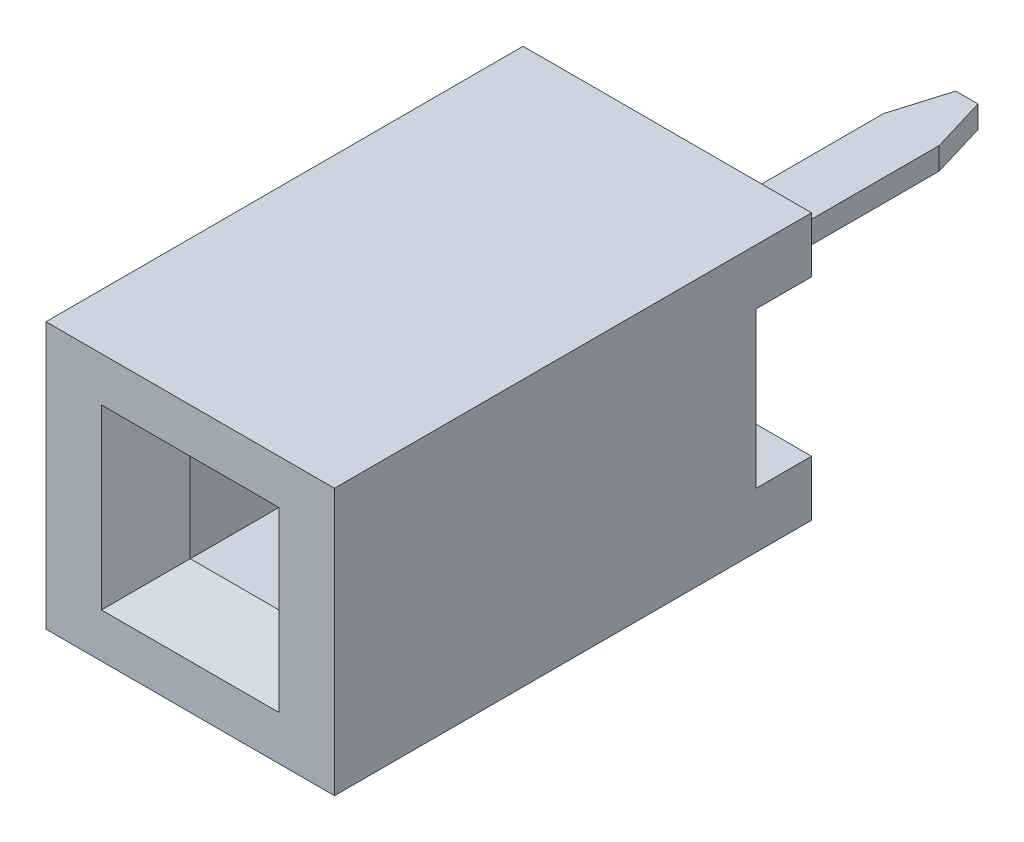
ISO-10303-21;
HEADER;
FILE_DESCRIPTION(('STEP AP214'),'2;1');
FILE_NAME('part.step','',(''),(''),'','','');
FILE_SCHEMA(('AUTOMOTIVE_DESIGN { 1 0 10303 214 1 1 1 1 }'));
ENDSEC;
DATA;
#1=APPLICATION_CONTEXT('core data for automotive mechanical design processes');
#2=APPLICATION_PROTOCOL_DEFINITION('international standard','automotive_design',2000,#1);
#3=PRODUCT_CONTEXT('',#1,'mechanical');
#4=PRODUCT('Part','Part','',(#3));
#5=PRODUCT_RELATED_PRODUCT_CATEGORY('part','',(#4));
#6=PRODUCT_DEFINITION_FORMATION('','',#4);
#7=PRODUCT_DEFINITION_CONTEXT('part definition',#1,'design');
#8=PRODUCT_DEFINITION('design','',#6,#7);
#9=PRODUCT_DEFINITION_SHAPE('','',#8);
#10=(LENGTH_UNIT() NAMED_UNIT(*) SI_UNIT(.MILLI.,.METRE.));
#11=(NAMED_UNIT(*) PLANE_ANGLE_UNIT() SI_UNIT($,.RADIAN.));
#12=(NAMED_UNIT(*) SI_UNIT($,.STERADIAN.) SOLID_ANGLE_UNIT());
#13=UNCERTAINTY_MEASURE_WITH_UNIT(LENGTH_MEASURE(1.E-05),#10,'distance_accuracy_value','');
#14=(GEOMETRIC_REPRESENTATION_CONTEXT(3) GLOBAL_UNCERTAINTY_ASSIGNED_CONTEXT((#13)) GLOBAL_UNIT_ASSIGNED_CONTEXT((#10,
#11,#12)) REPRESENTATION_CONTEXT('',''));
#15=CARTESIAN_POINT('',(0.,0.,0.));
#16=DIRECTION('',(0.,0.,1.));
#17=DIRECTION('',(1.,0.,0.));
#18=AXIS2_PLACEMENT_3D('',#15,#16,#17);
#19=CARTESIAN_POINT('',(-1.3,-0.700000000000001,1.2));
#20=DIRECTION('',(0.,0.,1.));
#21=DIRECTION('',(1.,0.,0.));
#22=AXIS2_PLACEMENT_3D('',#19,#20,#21);
#23=PLANE('',#22);
#24=DIRECTION('',(0.,-1.,0.));
#25=VECTOR('',#24,1.);
#26=CARTESIAN_POINT('',(0.4,-0.400000000000001,1.2));
#27=LINE('',#26,#25);
#28=CARTESIAN_POINT('',(0.4,-0.1,1.2));
#29=VERTEX_POINT('',#28);
#30=CARTESIAN_POINT('',(0.4,-0.400000000000001,1.2));
#31=VERTEX_POINT('',#30);
#32=EDGE_CURVE('E250',#29,#31,#27,.T.);
#33=ORIENTED_EDGE('',*,*,#32,.F.);
#34=DIRECTION('',(-1.,0.,0.));
#35=VECTOR('',#34,1.);
#36=CARTESIAN_POINT('',(0.4,-0.1,1.2));
#37=LINE('',#36,#35);
#38=CARTESIAN_POINT('',(-0.4,-0.1,1.2));
#39=VERTEX_POINT('',#38);
#40=EDGE_CURVE('E386',#29,#39,#37,.T.);
#41=ORIENTED_EDGE('',*,*,#40,.T.);
#42=DIRECTION('',(0.,1.,0.));
#43=VECTOR('',#42,1.);
#44=CARTESIAN_POINT('',(-0.4,-0.400000000000001,1.2));
#45=LINE('',#44,#43);
#46=CARTESIAN_POINT('',(-0.4,-0.400000000000001,1.2));
#47=VERTEX_POINT('',#46);
#48=EDGE_CURVE('E258',#47,#39,#45,.T.);
#49=ORIENTED_EDGE('',*,*,#48,.F.);
#50=DIRECTION('',(-1.,0.,0.));
#51=VECTOR('',#50,1.);
#52=CARTESIAN_POINT('',(0.4,-0.400000000000001,1.2));
#53=LINE('',#52,#51);
#54=EDGE_CURVE('E261',#31,#47,#53,.T.);
#55=ORIENTED_EDGE('',*,*,#54,.F.);
#56=EDGE_LOOP('',(#33,#41,#49,#55));
#57=FACE_BOUND('',#56,.T.);
#58=ADVANCED_FACE('F36',(#57),#23,.T.);
#59=CARTESIAN_POINT('',(-1.3,-0.700000000000001,0.5));
#60=DIRECTION('',(0.,0.,1.));
#61=DIRECTION('',(1.,0.,0.));
#62=AXIS2_PLACEMENT_3D('',#59,#60,#61);
#63=PLANE('',#62);
#64=DIRECTION('',(0.,-1.,0.));
#65=VECTOR('',#64,1.);
#66=CARTESIAN_POINT('',(1.3,-0.700000000000001,0.5));
#67=LINE('',#66,#65);
#68=CARTESIAN_POINT('',(1.3,0.7,0.5));
#69=VERTEX_POINT('',#68);
#70=CARTESIAN_POINT('',(1.3,-0.700000000000001,0.5));
#71=VERTEX_POINT('',#70);
#72=EDGE_CURVE('E286',#69,#71,#67,.T.);
#73=ORIENTED_EDGE('',*,*,#72,.T.);
#74=DIRECTION('',(1.,0.,0.));
#75=VECTOR('',#74,1.);
#76=CARTESIAN_POINT('',(-1.3,-0.700000000000001,0.5));
#77=LINE('',#76,#75);
#78=CARTESIAN_POINT('',(-1.3,-0.700000000000001,0.5));
#79=VERTEX_POINT('',#78);
#80=EDGE_CURVE('E294',#79,#71,#77,.T.);
#81=ORIENTED_EDGE('',*,*,#80,.F.);
#82=DIRECTION('',(0.,-1.,0.));
#83=VECTOR('',#82,1.);
#84=CARTESIAN_POINT('',(-1.3,-0.700000000000001,0.5));
#85=LINE('',#84,#83);
#86=CARTESIAN_POINT('',(-1.3,0.7,0.5));
#87=VERTEX_POINT('',#86);
#88=EDGE_CURVE('E276',#87,#79,#85,.T.);
#89=ORIENTED_EDGE('',*,*,#88,.F.);
#90=DIRECTION('',(1.,0.,0.));
#91=VECTOR('',#90,1.);
#92=CARTESIAN_POINT('',(-1.3,0.7,0.5));
#93=LINE('',#92,#91);
#94=EDGE_CURVE('E296',#87,#69,#93,.T.);
#95=ORIENTED_EDGE('',*,*,#94,.T.);
#96=EDGE_LOOP('',(#73,#81,#89,#95));
#97=FACE_BOUND('',#96,.T.);
#98=DIRECTION('',(1.,0.,0.));
#99=VECTOR('',#98,1.);
#100=CARTESIAN_POINT('',(0.250000000000001,0.1,0.5));
#101=LINE('',#100,#99);
#102=CARTESIAN_POINT('',(-0.25,0.1,0.5));
#103=VERTEX_POINT('',#102);
#104=CARTESIAN_POINT('',(0.250000000000001,0.1,0.5));
#105=VERTEX_POINT('',#104);
#106=EDGE_CURVE('E729',#103,#105,#101,.T.);
#107=ORIENTED_EDGE('',*,*,#106,.F.);
#108=DIRECTION('',(0.,-1.,0.));
#109=VECTOR('',#108,1.);
#110=CARTESIAN_POINT('',(-0.25,0.1,0.5));
#111=LINE('',#110,#109);
#112=CARTESIAN_POINT('',(-0.25,-0.1,0.5));
#113=VERTEX_POINT('',#112);
#114=EDGE_CURVE('E255',#103,#113,#111,.T.);
#115=ORIENTED_EDGE('',*,*,#114,.T.);
#116=DIRECTION('',(1.,0.,0.));
#117=VECTOR('',#116,1.);
#118=CARTESIAN_POINT('',(0.250000000000001,-0.1,0.5));
#119=LINE('',#118,#117);
#120=CARTESIAN_POINT('',(0.250000000000001,-0.1,0.5));
#121=VERTEX_POINT('',#120);
#122=EDGE_CURVE('E748',#113,#121,#119,.T.);
#123=ORIENTED_EDGE('',*,*,#122,.T.);
#124=DIRECTION('',(0.,-1.,0.));
#125=VECTOR('',#124,1.);
#126=CARTESIAN_POINT('',(0.250000000000001,0.1,0.5));
#127=LINE('',#126,#125);
#128=EDGE_CURVE('E61',#105,#121,#127,.T.);
#129=ORIENTED_EDGE('',*,*,#128,.F.);
#130=EDGE_LOOP('',(#107,#115,#123,#129));
#131=FACE_BOUND('',#130,.T.);
#132=ADVANCED_FACE('F404',(#97,#131),#63,.F.);
#133=CARTESIAN_POINT('',(1.3,1.2,0.));
#134=DIRECTION('',(0.,0.,1.));
#135=DIRECTION('',(0.,-1.,0.));
#136=AXIS2_PLACEMENT_3D('',#133,#134,#135);
#137=PLANE('',#136);
#138=DIRECTION('',(0.,1.,0.));
#139=VECTOR('',#138,1.);
#140=CARTESIAN_POINT('',(-1.3,1.2,0.));
#141=LINE('',#140,#139);
#142=CARTESIAN_POINT('',(-1.3,-1.2,0.));
#143=VERTEX_POINT('',#142);
#144=CARTESIAN_POINT('',(-1.3,-0.700000000000001,0.));
#145=VERTEX_POINT('',#144);
#146=EDGE_CURVE('E315',#143,#145,#141,.T.);
#147=ORIENTED_EDGE('',*,*,#146,.T.);
#148=DIRECTION('',(1.,0.,0.));
#149=VECTOR('',#148,1.);
#150=CARTESIAN_POINT('',(-1.3,-0.700000000000001,0.));
#151=LINE('',#150,#149);
#152=CARTESIAN_POINT('',(1.3,-0.700000000000001,0.));
#153=VERTEX_POINT('',#152);
#154=EDGE_CURVE('E290',#145,#153,#151,.T.);
#155=ORIENTED_EDGE('',*,*,#154,.T.);
#156=DIRECTION('',(0.,1.,0.));
#157=VECTOR('',#156,1.);
#158=CARTESIAN_POINT('',(1.3,1.2,0.));
#159=LINE('',#158,#157);
#160=CARTESIAN_POINT('',(1.3,-1.2,0.));
#161=VERTEX_POINT('',#160);
#162=EDGE_CURVE('E304',#161,#153,#159,.T.);
#163=ORIENTED_EDGE('',*,*,#162,.F.);
#164=DIRECTION('',(-1.,0.,0.));
#165=VECTOR('',#164,1.);
#166=CARTESIAN_POINT('',(1.3,-1.2,0.));
#167=LINE('',#166,#165);
#168=EDGE_CURVE('E329',#161,#143,#167,.T.);
#169=ORIENTED_EDGE('',*,*,#168,.T.);
#170=EDGE_LOOP('',(#147,#155,#163,#169));
#171=FACE_BOUND('',#170,.T.);
#172=ADVANCED_FACE('F408',(#171),#137,.F.);
#173=CARTESIAN_POINT('',(1.3,-1.2,0.));
#174=DIRECTION('',(0.,1.,0.));
#175=DIRECTION('',(0.,0.,1.));
#176=AXIS2_PLACEMENT_3D('',#173,#174,#175);
#177=PLANE('',#176);
#178=DIRECTION('',(0.,0.,-1.));
#179=VECTOR('',#178,1.);
#180=CARTESIAN_POINT('',(-1.3,-1.2,0.));
#181=LINE('',#180,#179);
#182=CARTESIAN_POINT('',(-1.3,-1.2,4.3));
#183=VERTEX_POINT('',#182);
#184=EDGE_CURVE('E293',#183,#143,#181,.T.);
#185=ORIENTED_EDGE('',*,*,#184,.T.);
#186=ORIENTED_EDGE('',*,*,#168,.F.);
#187=DIRECTION('',(0.,0.,-1.));
#188=VECTOR('',#187,1.);
#189=CARTESIAN_POINT('',(1.3,-1.2,0.));
#190=LINE('',#189,#188);
#191=CARTESIAN_POINT('',(1.3,-1.2,4.3));
#192=VERTEX_POINT('',#191);
#193=EDGE_CURVE('E299',#192,#161,#190,.T.);
#194=ORIENTED_EDGE('',*,*,#193,.F.);
#195=DIRECTION('',(-1.,0.,0.));
#196=VECTOR('',#195,1.);
#197=CARTESIAN_POINT('',(1.3,-1.2,4.3));
#198=LINE('',#197,#196);
#199=EDGE_CURVE('E311',#192,#183,#198,.T.);
#200=ORIENTED_EDGE('',*,*,#199,.T.);
#201=EDGE_LOOP('',(#185,#186,#194,#200));
#202=FACE_BOUND('',#201,.T.);
#203=ADVANCED_FACE('F445',(#202),#177,.F.);
#204=CARTESIAN_POINT('',(1.3,0.7,0.));
#205=VERTEX_POINT('',#204);
#206=CARTESIAN_POINT('',(1.3,1.2,0.));
#207=VERTEX_POINT('',#206);
#208=EDGE_CURVE('E302',#205,#207,#159,.T.);
#209=ORIENTED_EDGE('',*,*,#208,.F.);
#210=DIRECTION('',(1.,0.,0.));
#211=VECTOR('',#210,1.);
#212=CARTESIAN_POINT('',(-1.3,0.7,0.));
#213=LINE('',#212,#211);
#214=CARTESIAN_POINT('',(-1.3,0.7,0.));
#215=VERTEX_POINT('',#214);
#216=EDGE_CURVE('E283',#215,#205,#213,.T.);
#217=ORIENTED_EDGE('',*,*,#216,.F.);
#218=CARTESIAN_POINT('',(-1.3,1.2,0.));
#219=VERTEX_POINT('',#218);
#220=EDGE_CURVE('E314',#215,#219,#141,.T.);
#221=ORIENTED_EDGE('',*,*,#220,.T.);
#222=DIRECTION('',(-1.,0.,0.));
#223=VECTOR('',#222,1.);
#224=CARTESIAN_POINT('',(1.3,1.2,0.));
#225=LINE('',#224,#223);
#226=EDGE_CURVE('E326',#207,#219,#225,.T.);
#227=ORIENTED_EDGE('',*,*,#226,.F.);
#228=EDGE_LOOP('',(#209,#217,#221,#227));
#229=FACE_BOUND('',#228,.T.);
#230=ADVANCED_FACE('F441',(#229),#137,.F.);
#231=CARTESIAN_POINT('',(1.3,1.2,0.));
#232=DIRECTION('',(0.,-1.,0.));
#233=DIRECTION('',(0.,0.,-1.));
#234=AXIS2_PLACEMENT_3D('',#231,#232,#233);
#235=PLANE('',#234);
#236=DIRECTION('',(0.,0.,1.));
#237=VECTOR('',#236,1.);
#238=CARTESIAN_POINT('',(-1.3,1.2,0.));
#239=LINE('',#238,#237);
#240=CARTESIAN_POINT('',(-1.3,1.2,4.3));
#241=VERTEX_POINT('',#240);
#242=EDGE_CURVE('E318',#219,#241,#239,.T.);
#243=ORIENTED_EDGE('',*,*,#242,.T.);
#244=DIRECTION('',(-1.,0.,0.));
#245=VECTOR('',#244,1.);
#246=CARTESIAN_POINT('',(1.3,1.2,4.3));
#247=LINE('',#246,#245);
#248=CARTESIAN_POINT('',(1.3,1.2,4.3));
#249=VERTEX_POINT('',#248);
#250=EDGE_CURVE('E323',#249,#241,#247,.T.);
#251=ORIENTED_EDGE('',*,*,#250,.F.);
#252=DIRECTION('',(0.,0.,1.));
#253=VECTOR('',#252,1.);
#254=CARTESIAN_POINT('',(1.3,1.2,0.));
#255=LINE('',#254,#253);
#256=EDGE_CURVE('E307',#207,#249,#255,.T.);
#257=ORIENTED_EDGE('',*,*,#256,.F.);
#258=ORIENTED_EDGE('',*,*,#226,.T.);
#259=EDGE_LOOP('',(#243,#251,#257,#258));
#260=FACE_BOUND('',#259,.T.);
#261=ADVANCED_FACE('F438',(#260),#235,.F.);
#262=CARTESIAN_POINT('',(1.3,1.2,4.3));
#263=DIRECTION('',(0.,0.,-1.));
#264=DIRECTION('',(-1.,0.,0.));
#265=AXIS2_PLACEMENT_3D('',#262,#263,#264);
#266=PLANE('',#265);
#267=DIRECTION('',(0.,-1.,0.));
#268=VECTOR('',#267,1.);
#269=CARTESIAN_POINT('',(0.800000000000001,1.2,4.3));
#270=LINE('',#269,#268);
#271=CARTESIAN_POINT('',(0.800000000000001,0.800000000000001,4.3));
#272=VERTEX_POINT('',#271);
#273=CARTESIAN_POINT('',(0.800000000000002,-0.800000000000003,4.3));
#274=VERTEX_POINT('',#273);
#275=EDGE_CURVE('E339',#272,#274,#270,.T.);
#276=ORIENTED_EDGE('',*,*,#275,.T.);
#277=DIRECTION('',(-1.,0.,0.));
#278=VECTOR('',#277,1.);
#279=CARTESIAN_POINT('',(1.3,-0.800000000000003,4.3));
#280=LINE('',#279,#278);
#281=CARTESIAN_POINT('',(-0.800000000000002,-0.800000000000003,4.3));
#282=VERTEX_POINT('',#281);
#283=EDGE_CURVE('E341',#274,#282,#280,.T.);
#284=ORIENTED_EDGE('',*,*,#283,.T.);
#285=DIRECTION('',(0.,1.,0.));
#286=VECTOR('',#285,1.);
#287=CARTESIAN_POINT('',(-0.800000000000002,1.2,4.3));
#288=LINE('',#287,#286);
#289=CARTESIAN_POINT('',(-0.800000000000002,0.800000000000001,4.3));
#290=VERTEX_POINT('',#289);
#291=EDGE_CURVE('E335',#282,#290,#288,.T.);
#292=ORIENTED_EDGE('',*,*,#291,.T.);
#293=DIRECTION('',(1.,0.,0.));
#294=VECTOR('',#293,1.);
#295=CARTESIAN_POINT('',(1.3,0.800000000000001,4.3));
#296=LINE('',#295,#294);
#297=EDGE_CURVE('E337',#290,#272,#296,.T.);
#298=ORIENTED_EDGE('',*,*,#297,.T.);
#299=EDGE_LOOP('',(#276,#284,#292,#298));
#300=FACE_BOUND('',#299,.T.);
#301=DIRECTION('',(0.,-1.,0.));
#302=VECTOR('',#301,1.);
#303=CARTESIAN_POINT('',(-1.3,1.2,4.3));
#304=LINE('',#303,#302);
#305=EDGE_CURVE('E303',#241,#183,#304,.T.);
#306=ORIENTED_EDGE('',*,*,#305,.T.);
#307=ORIENTED_EDGE('',*,*,#199,.F.);
#308=DIRECTION('',(0.,-1.,0.));
#309=VECTOR('',#308,1.);
#310=CARTESIAN_POINT('',(1.3,1.2,4.3));
#311=LINE('',#310,#309);
#312=EDGE_CURVE('E309',#249,#192,#311,.T.);
#313=ORIENTED_EDGE('',*,*,#312,.F.);
#314=ORIENTED_EDGE('',*,*,#250,.T.);
#315=EDGE_LOOP('',(#306,#307,#313,#314));
#316=FACE_BOUND('',#315,.T.);
#317=ADVANCED_FACE('F367',(#300,#316),#266,.F.);
#318=CARTESIAN_POINT('',(1.3,0.,0.));
#319=DIRECTION('',(1.,0.,0.));
#320=DIRECTION('',(0.,0.,-1.));
#321=AXIS2_PLACEMENT_3D('',#318,#319,#320);
#322=PLANE('',#321);
#323=DIRECTION('',(0.,0.,-1.));
#324=VECTOR('',#323,1.);
#325=CARTESIAN_POINT('',(1.3,-0.700000000000001,0.));
#326=LINE('',#325,#324);
#327=EDGE_CURVE('E277',#71,#153,#326,.T.);
#328=ORIENTED_EDGE('',*,*,#327,.F.);
#329=ORIENTED_EDGE('',*,*,#72,.F.);
#330=DIRECTION('',(0.,0.,1.));
#331=VECTOR('',#330,1.);
#332=CARTESIAN_POINT('',(1.3,0.7,0.5));
#333=LINE('',#332,#331);
#334=EDGE_CURVE('E272',#205,#69,#333,.T.);
#335=ORIENTED_EDGE('',*,*,#334,.F.);
#336=ORIENTED_EDGE('',*,*,#208,.T.);
#337=ORIENTED_EDGE('',*,*,#256,.T.);
#338=ORIENTED_EDGE('',*,*,#312,.T.);
#339=ORIENTED_EDGE('',*,*,#193,.T.);
#340=ORIENTED_EDGE('',*,*,#162,.T.);
#341=EDGE_LOOP('',(#328,#329,#335,#336,#337,#338,#339,#340));
#342=FACE_BOUND('',#341,.T.);
#343=ADVANCED_FACE('F429',(#342),#322,.T.);
#344=CARTESIAN_POINT('',(-1.3,0.,0.));
#345=DIRECTION('',(1.,0.,0.));
#346=DIRECTION('',(0.,0.,-1.));
#347=AXIS2_PLACEMENT_3D('',#344,#345,#346);
#348=PLANE('',#347);
#349=ORIENTED_EDGE('',*,*,#88,.T.);
#350=DIRECTION('',(0.,0.,-1.));
#351=VECTOR('',#350,1.);
#352=CARTESIAN_POINT('',(-1.3,-0.700000000000001,0.));
#353=LINE('',#352,#351);
#354=EDGE_CURVE('E280',#79,#145,#353,.T.);
#355=ORIENTED_EDGE('',*,*,#354,.T.);
#356=ORIENTED_EDGE('',*,*,#146,.F.);
#357=ORIENTED_EDGE('',*,*,#184,.F.);
#358=ORIENTED_EDGE('',*,*,#305,.F.);
#359=ORIENTED_EDGE('',*,*,#242,.F.);
#360=ORIENTED_EDGE('',*,*,#220,.F.);
#361=DIRECTION('',(0.,0.,1.));
#362=VECTOR('',#361,1.);
#363=CARTESIAN_POINT('',(-1.3,0.7,0.5));
#364=LINE('',#363,#362);
#365=EDGE_CURVE('E273',#215,#87,#364,.T.);
#366=ORIENTED_EDGE('',*,*,#365,.T.);
#367=EDGE_LOOP('',(#349,#355,#356,#357,#358,#359,#360,#366));
#368=FACE_BOUND('',#367,.T.);
#369=ADVANCED_FACE('F423',(#368),#348,.F.);
#370=CARTESIAN_POINT('',(-1.3,-0.700000000000001,0.));
#371=DIRECTION('',(0.,-1.,0.));
#372=DIRECTION('',(0.,0.,-1.));
#373=AXIS2_PLACEMENT_3D('',#370,#371,#372);
#374=PLANE('',#373);
#375=ORIENTED_EDGE('',*,*,#327,.T.);
#376=ORIENTED_EDGE('',*,*,#154,.F.);
#377=ORIENTED_EDGE('',*,*,#354,.F.);
#378=ORIENTED_EDGE('',*,*,#80,.T.);
#379=EDGE_LOOP('',(#375,#376,#377,#378));
#380=FACE_BOUND('',#379,.T.);
#381=ADVANCED_FACE('F421',(#380),#374,.F.);
#382=CARTESIAN_POINT('',(-1.3,0.7,0.5));
#383=DIRECTION('',(0.,1.,0.));
#384=DIRECTION('',(0.,0.,1.));
#385=AXIS2_PLACEMENT_3D('',#382,#383,#384);
#386=PLANE('',#385);
#387=ORIENTED_EDGE('',*,*,#334,.T.);
#388=ORIENTED_EDGE('',*,*,#94,.F.);
#389=ORIENTED_EDGE('',*,*,#365,.F.);
#390=ORIENTED_EDGE('',*,*,#216,.T.);
#391=EDGE_LOOP('',(#387,#388,#389,#390));
#392=FACE_BOUND('',#391,.T.);
#393=ADVANCED_FACE('F400',(#392),#386,.F.);
#394=CARTESIAN_POINT('',(-0.4,-0.400000000000001,-0.631370849898476));
#395=DIRECTION('',(-1.,0.,0.));
#396=DIRECTION('',(0.,-1.,0.));
#397=AXIS2_PLACEMENT_3D('',#394,#395,#396);
#398=PLANE('',#397);
#399=DIRECTION('',(0.,-1.,0.));
#400=VECTOR('',#399,1.);
#401=CARTESIAN_POINT('',(-0.4,0.1,3.1));
#402=LINE('',#401,#400);
#403=CARTESIAN_POINT('',(-0.4,0.1,3.1));
#404=VERTEX_POINT('',#403);
#405=CARTESIAN_POINT('',(-0.4,-0.1,3.1));
#406=VERTEX_POINT('',#405);
#407=EDGE_CURVE('E751',#404,#406,#402,.T.);
#408=ORIENTED_EDGE('',*,*,#407,.F.);
#409=DIRECTION('',(0.,0.,1.));
#410=VECTOR('',#409,1.);
#411=CARTESIAN_POINT('',(-0.4,0.1,1.2));
#412=LINE('',#411,#410);
#413=CARTESIAN_POINT('',(-0.4,0.1,1.2));
#414=VERTEX_POINT('',#413);
#415=EDGE_CURVE('E244',#414,#404,#412,.T.);
#416=ORIENTED_EDGE('',*,*,#415,.F.);
#417=CARTESIAN_POINT('',(-0.4,0.399999999999999,1.2));
#418=VERTEX_POINT('',#417);
#419=EDGE_CURVE('E243',#414,#418,#45,.T.);
#420=ORIENTED_EDGE('',*,*,#419,.T.);
#421=DIRECTION('',(0.,0.,1.));
#422=VECTOR('',#421,1.);
#423=CARTESIAN_POINT('',(-0.4,0.399999999999999,-0.631370849898476));
#424=LINE('',#423,#422);
#425=CARTESIAN_POINT('',(-0.4,0.399999999999999,3.9));
#426=VERTEX_POINT('',#425);
#427=EDGE_CURVE('E253',#418,#426,#424,.T.);
#428=ORIENTED_EDGE('',*,*,#427,.T.);
#429=DIRECTION('',(0.,-1.,0.));
#430=VECTOR('',#429,1.);
#431=CARTESIAN_POINT('',(-0.4,-0.400000000000001,3.9));
#432=LINE('',#431,#430);
#433=CARTESIAN_POINT('',(-0.4,-0.400000000000001,3.9));
#434=VERTEX_POINT('',#433);
#435=EDGE_CURVE('E12',#426,#434,#432,.T.);
#436=ORIENTED_EDGE('',*,*,#435,.T.);
#437=DIRECTION('',(0.,0.,1.));
#438=VECTOR('',#437,1.);
#439=CARTESIAN_POINT('',(-0.4,-0.400000000000001,-0.631370849898476));
#440=LINE('',#439,#438);
#441=EDGE_CURVE('E268',#47,#434,#440,.T.);
#442=ORIENTED_EDGE('',*,*,#441,.F.);
#443=ORIENTED_EDGE('',*,*,#48,.T.);
#444=DIRECTION('',(0.,0.,1.));
#445=VECTOR('',#444,1.);
#446=CARTESIAN_POINT('',(-0.4,-0.1,1.2));
#447=LINE('',#446,#445);
#448=EDGE_CURVE('E53',#39,#406,#447,.T.);
#449=ORIENTED_EDGE('',*,*,#448,.T.);
#450=EDGE_LOOP('',(#408,#416,#420,#428,#436,#442,#443,#449));
#451=FACE_BOUND('',#450,.T.);
#452=ADVANCED_FACE('F389',(#451),#398,.F.);
#453=CARTESIAN_POINT('',(0.4,0.399999999999999,-0.631370849898476));
#454=DIRECTION('',(0.,1.,0.));
#455=DIRECTION('',(0.,0.,1.));
#456=AXIS2_PLACEMENT_3D('',#453,#454,#455);
#457=PLANE('',#456);
#458=DIRECTION('',(0.,0.,1.));
#459=VECTOR('',#458,1.);
#460=CARTESIAN_POINT('',(0.4,0.399999999999999,-0.631370849898476));
#461=LINE('',#460,#459);
#462=CARTESIAN_POINT('',(0.4,0.399999999999999,1.2));
#463=VERTEX_POINT('',#462);
#464=CARTESIAN_POINT('',(0.4,0.399999999999999,3.9));
#465=VERTEX_POINT('',#464);
#466=EDGE_CURVE('E248',#463,#465,#461,.T.);
#467=ORIENTED_EDGE('',*,*,#466,.T.);
#468=DIRECTION('',(-1.,0.,0.));
#469=VECTOR('',#468,1.);
#470=CARTESIAN_POINT('',(0.4,0.399999999999999,3.9));
#471=LINE('',#470,#469);
#472=EDGE_CURVE('E45',#465,#426,#471,.T.);
#473=ORIENTED_EDGE('',*,*,#472,.T.);
#474=ORIENTED_EDGE('',*,*,#427,.F.);
#475=DIRECTION('',(1.,0.,0.));
#476=VECTOR('',#475,1.);
#477=CARTESIAN_POINT('',(0.4,0.399999999999999,1.2));
#478=LINE('',#477,#476);
#479=EDGE_CURVE('E249',#418,#463,#478,.T.);
#480=ORIENTED_EDGE('',*,*,#479,.T.);
#481=EDGE_LOOP('',(#467,#473,#474,#480));
#482=FACE_BOUND('',#481,.T.);
#483=ADVANCED_FACE('F392',(#482),#457,.F.);
#484=CARTESIAN_POINT('',(0.4,-0.400000000000001,-0.631370849898476));
#485=DIRECTION('',(1.,0.,0.));
#486=DIRECTION('',(0.,1.,0.));
#487=AXIS2_PLACEMENT_3D('',#484,#485,#486);
#488=PLANE('',#487);
#489=CARTESIAN_POINT('',(0.4,0.1,1.2));
#490=VERTEX_POINT('',#489);
#491=EDGE_CURVE('E241',#463,#490,#27,.T.);
#492=ORIENTED_EDGE('',*,*,#491,.T.);
#493=DIRECTION('',(0.,0.,-1.));
#494=VECTOR('',#493,1.);
#495=CARTESIAN_POINT('',(0.400000000000001,0.1,3.1));
#496=LINE('',#495,#494);
#497=CARTESIAN_POINT('',(0.400000000000001,0.1,3.1));
#498=VERTEX_POINT('',#497);
#499=EDGE_CURVE('E223',#498,#490,#496,.T.);
#500=ORIENTED_EDGE('',*,*,#499,.F.);
#501=DIRECTION('',(0.,-1.,0.));
#502=VECTOR('',#501,1.);
#503=CARTESIAN_POINT('',(0.400000000000001,0.1,3.1));
#504=LINE('',#503,#502);
#505=CARTESIAN_POINT('',(0.400000000000001,-0.1,3.1));
#506=VERTEX_POINT('',#505);
#507=EDGE_CURVE('E796',#498,#506,#504,.T.);
#508=ORIENTED_EDGE('',*,*,#507,.T.);
#509=DIRECTION('',(0.,0.,-1.));
#510=VECTOR('',#509,1.);
#511=CARTESIAN_POINT('',(0.400000000000001,-0.1,3.1));
#512=LINE('',#511,#510);
#513=EDGE_CURVE('E383',#506,#29,#512,.T.);
#514=ORIENTED_EDGE('',*,*,#513,.T.);
#515=ORIENTED_EDGE('',*,*,#32,.T.);
#516=DIRECTION('',(0.,0.,1.));
#517=VECTOR('',#516,1.);
#518=CARTESIAN_POINT('',(0.4,-0.400000000000001,-0.631370849898476));
#519=LINE('',#518,#517);
#520=CARTESIAN_POINT('',(0.4,-0.400000000000001,3.9));
#521=VERTEX_POINT('',#520);
#522=EDGE_CURVE('E265',#31,#521,#519,.T.);
#523=ORIENTED_EDGE('',*,*,#522,.T.);
#524=DIRECTION('',(0.,1.,0.));
#525=VECTOR('',#524,1.);
#526=CARTESIAN_POINT('',(0.4,-0.400000000000001,3.9));
#527=LINE('',#526,#525);
#528=EDGE_CURVE('E344',#521,#465,#527,.T.);
#529=ORIENTED_EDGE('',*,*,#528,.T.);
#530=ORIENTED_EDGE('',*,*,#466,.F.);
#531=EDGE_LOOP('',(#492,#500,#508,#514,#515,#523,#529,#530));
#532=FACE_BOUND('',#531,.T.);
#533=ADVANCED_FACE('F246',(#532),#488,.F.);
#534=CARTESIAN_POINT('',(0.4,-0.400000000000001,-0.631370849898476));
#535=DIRECTION('',(0.,-1.,0.));
#536=DIRECTION('',(0.,0.,-1.));
#537=AXIS2_PLACEMENT_3D('',#534,#535,#536);
#538=PLANE('',#537);
#539=ORIENTED_EDGE('',*,*,#441,.T.);
#540=DIRECTION('',(1.,0.,0.));
#541=VECTOR('',#540,1.);
#542=CARTESIAN_POINT('',(0.4,-0.400000000000001,3.9));
#543=LINE('',#542,#541);
#544=EDGE_CURVE('E332',#434,#521,#543,.T.);
#545=ORIENTED_EDGE('',*,*,#544,.T.);
#546=ORIENTED_EDGE('',*,*,#522,.F.);
#547=ORIENTED_EDGE('',*,*,#54,.T.);
#548=EDGE_LOOP('',(#539,#545,#546,#547));
#549=FACE_BOUND('',#548,.T.);
#550=ADVANCED_FACE('F377',(#549),#538,.F.);
#551=DIRECTION('',(-1.,0.,0.));
#552=VECTOR('',#551,1.);
#553=CARTESIAN_POINT('',(0.4,0.1,1.2));
#554=LINE('',#553,#552);
#555=EDGE_CURVE('E226',#490,#414,#554,.T.);
#556=ORIENTED_EDGE('',*,*,#555,.F.);
#557=ORIENTED_EDGE('',*,*,#491,.F.);
#558=ORIENTED_EDGE('',*,*,#479,.F.);
#559=ORIENTED_EDGE('',*,*,#419,.F.);
#560=EDGE_LOOP('',(#556,#557,#558,#559));
#561=FACE_BOUND('',#560,.T.);
#562=ADVANCED_FACE('F239',(#561),#23,.T.);
#563=CARTESIAN_POINT('',(0.4,0.399999999999999,3.9));
#564=DIRECTION('',(0.,0.707106781186545,-0.70710678118655));
#565=DIRECTION('',(-1.,0.,0.));
#566=AXIS2_PLACEMENT_3D('',#563,#564,#565);
#567=PLANE('',#566);
#568=DIRECTION('',(0.577350269189627,0.577350269189627,0.577350269189624));
#569=VECTOR('',#568,1.);
#570=CARTESIAN_POINT('',(0.133333333333332,0.133333333333331,3.63333333333333));
#571=LINE('',#570,#569);
#572=EDGE_CURVE('E350',#272,#465,#571,.F.);
#573=ORIENTED_EDGE('',*,*,#572,.F.);
#574=ORIENTED_EDGE('',*,*,#297,.F.);
#575=DIRECTION('',(-0.577350269189627,0.577350269189627,0.577350269189624));
#576=VECTOR('',#575,1.);
#577=CARTESIAN_POINT('',(-0.133333333333332,0.133333333333331,3.63333333333333));
#578=LINE('',#577,#576);
#579=EDGE_CURVE('E40',#426,#290,#578,.T.);
#580=ORIENTED_EDGE('',*,*,#579,.F.);
#581=ORIENTED_EDGE('',*,*,#472,.F.);
#582=EDGE_LOOP('',(#573,#574,#580,#581));
#583=FACE_BOUND('',#582,.T.);
#584=ADVANCED_FACE('F38',(#583),#567,.F.);
#585=CARTESIAN_POINT('',(-0.4,-0.400000000000001,3.9));
#586=DIRECTION('',(-0.707106781186545,0.,-0.70710678118655));
#587=DIRECTION('',(0.,-1.,0.));
#588=AXIS2_PLACEMENT_3D('',#585,#586,#587);
#589=PLANE('',#588);
#590=ORIENTED_EDGE('',*,*,#579,.T.);
#591=ORIENTED_EDGE('',*,*,#291,.F.);
#592=DIRECTION('',(0.577350269189627,0.577350269189627,-0.577350269189623));
#593=VECTOR('',#592,1.);
#594=CARTESIAN_POINT('',(-0.133333333333332,-0.133333333333333,3.63333333333333));
#595=LINE('',#594,#593);
#596=EDGE_CURVE('E349',#434,#282,#595,.F.);
#597=ORIENTED_EDGE('',*,*,#596,.F.);
#598=ORIENTED_EDGE('',*,*,#435,.F.);
#599=EDGE_LOOP('',(#590,#591,#597,#598));
#600=FACE_BOUND('',#599,.T.);
#601=ADVANCED_FACE('F361',(#600),#589,.F.);
#602=CARTESIAN_POINT('',(0.4,-0.400000000000001,3.9));
#603=DIRECTION('',(0.707106781186545,0.,-0.70710678118655));
#604=DIRECTION('',(0.,1.,0.));
#605=AXIS2_PLACEMENT_3D('',#602,#603,#604);
#606=PLANE('',#605);
#607=ORIENTED_EDGE('',*,*,#572,.T.);
#608=ORIENTED_EDGE('',*,*,#528,.F.);
#609=DIRECTION('',(0.577350269189627,-0.577350269189627,0.577350269189623));
#610=VECTOR('',#609,1.);
#611=CARTESIAN_POINT('',(0.4,-0.400000000000001,3.9));
#612=LINE('',#611,#610);
#613=EDGE_CURVE('E347',#274,#521,#612,.F.);
#614=ORIENTED_EDGE('',*,*,#613,.F.);
#615=ORIENTED_EDGE('',*,*,#275,.F.);
#616=EDGE_LOOP('',(#607,#608,#614,#615));
#617=FACE_BOUND('',#616,.T.);
#618=ADVANCED_FACE('F374',(#617),#606,.F.);
#619=CARTESIAN_POINT('',(0.4,-0.400000000000001,3.9));
#620=DIRECTION('',(0.,-0.707106781186545,-0.70710678118655));
#621=DIRECTION('',(1.,0.,0.));
#622=AXIS2_PLACEMENT_3D('',#619,#620,#621);
#623=PLANE('',#622);
#624=ORIENTED_EDGE('',*,*,#596,.T.);
#625=ORIENTED_EDGE('',*,*,#283,.F.);
#626=ORIENTED_EDGE('',*,*,#613,.T.);
#627=ORIENTED_EDGE('',*,*,#544,.F.);
#628=EDGE_LOOP('',(#624,#625,#626,#627));
#629=FACE_BOUND('',#628,.T.);
#630=ADVANCED_FACE('F372',(#629),#623,.F.);
#631=CARTESIAN_POINT('',(0.25,0.1,0.));
#632=DIRECTION('',(-1.,0.,0.));
#633=DIRECTION('',(0.,0.,1.));
#634=AXIS2_PLACEMENT_3D('',#631,#632,#633);
#635=PLANE('',#634);
#636=DIRECTION('',(0.,0.,-1.));
#637=VECTOR('',#636,1.);
#638=CARTESIAN_POINT('',(0.25,-0.1,0.));
#639=LINE('',#638,#637);
#640=CARTESIAN_POINT('',(0.25,-0.1,-2.2));
#641=VERTEX_POINT('',#640);
#642=EDGE_CURVE('E750',#121,#641,#639,.T.);
#643=ORIENTED_EDGE('',*,*,#642,.T.);
#644=DIRECTION('',(0.,-1.,0.));
#645=VECTOR('',#644,1.);
#646=CARTESIAN_POINT('',(0.25,0.1,-2.2));
#647=LINE('',#646,#645);
#648=CARTESIAN_POINT('',(0.25,0.1,-2.2));
#649=VERTEX_POINT('',#648);
#650=EDGE_CURVE('E768',#649,#641,#647,.T.);
#651=ORIENTED_EDGE('',*,*,#650,.F.);
#652=DIRECTION('',(0.,0.,-1.));
#653=VECTOR('',#652,1.);
#654=CARTESIAN_POINT('',(0.25,0.1,0.));
#655=LINE('',#654,#653);
#656=EDGE_CURVE('E732',#105,#649,#655,.T.);
#657=ORIENTED_EDGE('',*,*,#656,.F.);
#658=ORIENTED_EDGE('',*,*,#128,.T.);
#659=EDGE_LOOP('',(#643,#651,#657,#658));
#660=FACE_BOUND('',#659,.T.);
#661=ADVANCED_FACE('F452',(#660),#635,.F.);
#662=CARTESIAN_POINT('',(0.25,0.1,-2.2));
#663=DIRECTION('',(-0.957826285221151,0.,0.287347885566345));
#664=DIRECTION('',(0.287347885566345,0.,0.957826285221152));
#665=AXIS2_PLACEMENT_3D('',#662,#663,#664);
#666=PLANE('',#665);
#667=DIRECTION('',(-0.287347885566345,0.,-0.957826285221151));
#668=VECTOR('',#667,1.);
#669=CARTESIAN_POINT('',(0.25,-0.1,-2.2));
#670=LINE('',#669,#668);
#671=CARTESIAN_POINT('',(0.1,-0.1,-2.7));
#672=VERTEX_POINT('',#671);
#673=EDGE_CURVE('E753',#641,#672,#670,.T.);
#674=ORIENTED_EDGE('',*,*,#673,.T.);
#675=DIRECTION('',(0.,-1.,0.));
#676=VECTOR('',#675,1.);
#677=CARTESIAN_POINT('',(0.1,0.1,-2.7));
#678=LINE('',#677,#676);
#679=CARTESIAN_POINT('',(0.1,0.1,-2.7));
#680=VERTEX_POINT('',#679);
#681=EDGE_CURVE('E765',#680,#672,#678,.T.);
#682=ORIENTED_EDGE('',*,*,#681,.F.);
#683=DIRECTION('',(-0.287347885566345,0.,-0.957826285221151));
#684=VECTOR('',#683,1.);
#685=CARTESIAN_POINT('',(0.25,0.1,-2.2));
#686=LINE('',#685,#684);
#687=EDGE_CURVE('E735',#649,#680,#686,.T.);
#688=ORIENTED_EDGE('',*,*,#687,.F.);
#689=ORIENTED_EDGE('',*,*,#650,.T.);
#690=EDGE_LOOP('',(#674,#682,#688,#689));
#691=FACE_BOUND('',#690,.T.);
#692=ADVANCED_FACE('F473',(#691),#666,.F.);
#693=CARTESIAN_POINT('',(-0.1,0.1,-2.7));
#694=DIRECTION('',(0.,0.,1.));
#695=DIRECTION('',(1.,0.,0.));
#696=AXIS2_PLACEMENT_3D('',#693,#694,#695);
#697=PLANE('',#696);
#698=DIRECTION('',(-1.,0.,0.));
#699=VECTOR('',#698,1.);
#700=CARTESIAN_POINT('',(-0.1,-0.1,-2.7));
#701=LINE('',#700,#699);
#702=CARTESIAN_POINT('',(-0.1,-0.1,-2.7));
#703=VERTEX_POINT('',#702);
#704=EDGE_CURVE('E755',#672,#703,#701,.T.);
#705=ORIENTED_EDGE('',*,*,#704,.T.);
#706=DIRECTION('',(0.,-1.,0.));
#707=VECTOR('',#706,1.);
#708=CARTESIAN_POINT('',(-0.1,0.1,-2.7));
#709=LINE('',#708,#707);
#710=CARTESIAN_POINT('',(-0.1,0.1,-2.7));
#711=VERTEX_POINT('',#710);
#712=EDGE_CURVE('E762',#711,#703,#709,.T.);
#713=ORIENTED_EDGE('',*,*,#712,.F.);
#714=DIRECTION('',(-1.,0.,0.));
#715=VECTOR('',#714,1.);
#716=CARTESIAN_POINT('',(-0.1,0.1,-2.7));
#717=LINE('',#716,#715);
#718=EDGE_CURVE('E742',#680,#711,#717,.T.);
#719=ORIENTED_EDGE('',*,*,#718,.F.);
#720=ORIENTED_EDGE('',*,*,#681,.T.);
#721=EDGE_LOOP('',(#705,#713,#719,#720));
#722=FACE_BOUND('',#721,.T.);
#723=ADVANCED_FACE('F479',(#722),#697,.F.);
#724=CARTESIAN_POINT('',(-0.25,0.1,-2.2));
#725=DIRECTION('',(0.957826285221152,0.,0.287347885566345));
#726=DIRECTION('',(0.287347885566345,0.,-0.957826285221152));
#727=AXIS2_PLACEMENT_3D('',#724,#725,#726);
#728=PLANE('',#727);
#729=DIRECTION('',(-0.287347885566345,0.,0.957826285221152));
#730=VECTOR('',#729,1.);
#731=CARTESIAN_POINT('',(-0.25,-0.1,-2.2));
#732=LINE('',#731,#730);
#733=CARTESIAN_POINT('',(-0.25,-0.1,-2.2));
#734=VERTEX_POINT('',#733);
#735=EDGE_CURVE('E757',#703,#734,#732,.T.);
#736=ORIENTED_EDGE('',*,*,#735,.T.);
#737=DIRECTION('',(0.,-1.,0.));
#738=VECTOR('',#737,1.);
#739=CARTESIAN_POINT('',(-0.25,0.1,-2.2));
#740=LINE('',#739,#738);
#741=CARTESIAN_POINT('',(-0.25,0.1,-2.2));
#742=VERTEX_POINT('',#741);
#743=EDGE_CURVE('E747',#742,#734,#740,.T.);
#744=ORIENTED_EDGE('',*,*,#743,.F.);
#745=DIRECTION('',(-0.287347885566345,0.,0.957826285221152));
#746=VECTOR('',#745,1.);
#747=CARTESIAN_POINT('',(-0.25,0.1,-2.2));
#748=LINE('',#747,#746);
#749=EDGE_CURVE('E744',#711,#742,#748,.T.);
#750=ORIENTED_EDGE('',*,*,#749,.F.);
#751=ORIENTED_EDGE('',*,*,#712,.T.);
#752=EDGE_LOOP('',(#736,#744,#750,#751));
#753=FACE_BOUND('',#752,.T.);
#754=ADVANCED_FACE('F487',(#753),#728,.F.);
#755=CARTESIAN_POINT('',(-0.25,0.1,0.));
#756=DIRECTION('',(1.,0.,0.));
#757=DIRECTION('',(0.,0.,-1.));
#758=AXIS2_PLACEMENT_3D('',#755,#756,#757);
#759=PLANE('',#758);
#760=DIRECTION('',(0.,0.,1.));
#761=VECTOR('',#760,1.);
#762=CARTESIAN_POINT('',(-0.25,-0.1,0.));
#763=LINE('',#762,#761);
#764=EDGE_CURVE('E737',#734,#113,#763,.T.);
#765=ORIENTED_EDGE('',*,*,#764,.T.);
#766=ORIENTED_EDGE('',*,*,#114,.F.);
#767=DIRECTION('',(0.,0.,1.));
#768=VECTOR('',#767,1.);
#769=CARTESIAN_POINT('',(-0.25,0.1,0.5));
#770=LINE('',#769,#768);
#771=EDGE_CURVE('E733',#742,#103,#770,.T.);
#772=ORIENTED_EDGE('',*,*,#771,.F.);
#773=ORIENTED_EDGE('',*,*,#743,.T.);
#774=EDGE_LOOP('',(#765,#766,#772,#773));
#775=FACE_BOUND('',#774,.T.);
#776=ADVANCED_FACE('F495',(#775),#759,.F.);
#777=CARTESIAN_POINT('',(0.,0.1,0.));
#778=DIRECTION('',(0.,-1.,0.));
#779=DIRECTION('',(0.,0.,-1.));
#780=AXIS2_PLACEMENT_3D('',#777,#778,#779);
#781=PLANE('',#780);
#782=ORIENTED_EDGE('',*,*,#771,.T.);
#783=ORIENTED_EDGE('',*,*,#106,.T.);
#784=ORIENTED_EDGE('',*,*,#656,.T.);
#785=ORIENTED_EDGE('',*,*,#687,.T.);
#786=ORIENTED_EDGE('',*,*,#718,.T.);
#787=ORIENTED_EDGE('',*,*,#749,.T.);
#788=EDGE_LOOP('',(#782,#783,#784,#785,#786,#787));
#789=FACE_BOUND('',#788,.T.);
#790=ADVANCED_FACE('F503',(#789),#781,.F.);
#791=CARTESIAN_POINT('',(0.,-0.1,0.));
#792=DIRECTION('',(0.,-1.,0.));
#793=DIRECTION('',(0.,0.,-1.));
#794=AXIS2_PLACEMENT_3D('',#791,#792,#793);
#795=PLANE('',#794);
#796=ORIENTED_EDGE('',*,*,#122,.F.);
#797=ORIENTED_EDGE('',*,*,#764,.F.);
#798=ORIENTED_EDGE('',*,*,#735,.F.);
#799=ORIENTED_EDGE('',*,*,#704,.F.);
#800=ORIENTED_EDGE('',*,*,#673,.F.);
#801=ORIENTED_EDGE('',*,*,#642,.F.);
#802=EDGE_LOOP('',(#796,#797,#798,#799,#800,#801));
#803=FACE_BOUND('',#802,.T.);
#804=ADVANCED_FACE('F511',(#803),#795,.T.);
#805=CARTESIAN_POINT('',(-0.4,0.1,3.1));
#806=DIRECTION('',(0.,0.,-1.));
#807=DIRECTION('',(-1.,0.,0.));
#808=AXIS2_PLACEMENT_3D('',#805,#806,#807);
#809=PLANE('',#808);
#810=DIRECTION('',(1.,0.,0.));
#811=VECTOR('',#810,1.);
#812=CARTESIAN_POINT('',(-0.4,-0.1,3.1));
#813=LINE('',#812,#811);
#814=CARTESIAN_POINT('',(-0.3,-0.1,3.1));
#815=VERTEX_POINT('',#814);
#816=EDGE_CURVE('E805',#406,#815,#813,.T.);
#817=ORIENTED_EDGE('',*,*,#816,.T.);
#818=DIRECTION('',(0.,-1.,0.));
#819=VECTOR('',#818,1.);
#820=CARTESIAN_POINT('',(-0.3,0.1,3.1));
#821=LINE('',#820,#819);
#822=CARTESIAN_POINT('',(-0.3,0.1,3.1));
#823=VERTEX_POINT('',#822);
#824=EDGE_CURVE('E782',#823,#815,#821,.T.);
#825=ORIENTED_EDGE('',*,*,#824,.F.);
#826=DIRECTION('',(1.,0.,0.));
#827=VECTOR('',#826,1.);
#828=CARTESIAN_POINT('',(-0.4,0.1,3.1));
#829=LINE('',#828,#827);
#830=EDGE_CURVE('E817',#404,#823,#829,.T.);
#831=ORIENTED_EDGE('',*,*,#830,.F.);
#832=ORIENTED_EDGE('',*,*,#407,.T.);
#833=EDGE_LOOP('',(#817,#825,#831,#832));
#834=FACE_BOUND('',#833,.T.);
#835=ADVANCED_FACE('F519',(#834),#809,.F.);
#836=CARTESIAN_POINT('',(-0.3,0.1,3.1));
#837=DIRECTION('',(-1.,0.,0.));
#838=DIRECTION('',(0.,0.,1.));
#839=AXIS2_PLACEMENT_3D('',#836,#837,#838);
#840=PLANE('',#839);
#841=DIRECTION('',(0.,0.,-1.));
#842=VECTOR('',#841,1.);
#843=CARTESIAN_POINT('',(-0.3,-0.1,3.1));
#844=LINE('',#843,#842);
#845=CARTESIAN_POINT('',(-0.3,-0.1,1.3));
#846=VERTEX_POINT('',#845);
#847=EDGE_CURVE('E803',#815,#846,#844,.T.);
#848=ORIENTED_EDGE('',*,*,#847,.T.);
#849=DIRECTION('',(0.,-1.,0.));
#850=VECTOR('',#849,1.);
#851=CARTESIAN_POINT('',(-0.3,0.1,1.3));
#852=LINE('',#851,#850);
#853=CARTESIAN_POINT('',(-0.3,0.1,1.3));
#854=VERTEX_POINT('',#853);
#855=EDGE_CURVE('E785',#854,#846,#852,.T.);
#856=ORIENTED_EDGE('',*,*,#855,.F.);
#857=DIRECTION('',(0.,0.,-1.));
#858=VECTOR('',#857,1.);
#859=CARTESIAN_POINT('',(-0.3,0.1,3.1));
#860=LINE('',#859,#858);
#861=EDGE_CURVE('E815',#823,#854,#860,.T.);
#862=ORIENTED_EDGE('',*,*,#861,.F.);
#863=ORIENTED_EDGE('',*,*,#824,.T.);
#864=EDGE_LOOP('',(#848,#856,#862,#863));
#865=FACE_BOUND('',#864,.T.);
#866=ADVANCED_FACE('F527',(#865),#840,.F.);
#867=CARTESIAN_POINT('',(-0.3,0.1,1.3));
#868=DIRECTION('',(0.,0.,-1.));
#869=DIRECTION('',(-1.,0.,0.));
#870=AXIS2_PLACEMENT_3D('',#867,#868,#869);
#871=PLANE('',#870);
#872=DIRECTION('',(1.,0.,0.));
#873=VECTOR('',#872,1.);
#874=CARTESIAN_POINT('',(-0.3,-0.1,1.3));
#875=LINE('',#874,#873);
#876=CARTESIAN_POINT('',(0.3,-0.1,1.3));
#877=VERTEX_POINT('',#876);
#878=EDGE_CURVE('E801',#846,#877,#875,.T.);
#879=ORIENTED_EDGE('',*,*,#878,.T.);
#880=DIRECTION('',(0.,-1.,0.));
#881=VECTOR('',#880,1.);
#882=CARTESIAN_POINT('',(0.3,0.1,1.3));
#883=LINE('',#882,#881);
#884=CARTESIAN_POINT('',(0.3,0.1,1.3));
#885=VERTEX_POINT('',#884);
#886=EDGE_CURVE('E790',#885,#877,#883,.T.);
#887=ORIENTED_EDGE('',*,*,#886,.F.);
#888=DIRECTION('',(1.,0.,0.));
#889=VECTOR('',#888,1.);
#890=CARTESIAN_POINT('',(-0.3,0.1,1.3));
#891=LINE('',#890,#889);
#892=EDGE_CURVE('E813',#854,#885,#891,.T.);
#893=ORIENTED_EDGE('',*,*,#892,.F.);
#894=ORIENTED_EDGE('',*,*,#855,.T.);
#895=EDGE_LOOP('',(#879,#887,#893,#894));
#896=FACE_BOUND('',#895,.T.);
#897=ADVANCED_FACE('F535',(#896),#871,.F.);
#898=CARTESIAN_POINT('',(0.3,0.1,1.3));
#899=DIRECTION('',(1.,0.,0.));
#900=DIRECTION('',(0.,0.,-1.));
#901=AXIS2_PLACEMENT_3D('',#898,#899,#900);
#902=PLANE('',#901);
#903=DIRECTION('',(0.,0.,1.));
#904=VECTOR('',#903,1.);
#905=CARTESIAN_POINT('',(0.3,-0.1,1.3));
#906=LINE('',#905,#904);
#907=CARTESIAN_POINT('',(0.300000000000001,-0.1,3.1));
#908=VERTEX_POINT('',#907);
#909=EDGE_CURVE('E799',#877,#908,#906,.T.);
#910=ORIENTED_EDGE('',*,*,#909,.T.);
#911=DIRECTION('',(0.,-1.,0.));
#912=VECTOR('',#911,1.);
#913=CARTESIAN_POINT('',(0.300000000000001,0.1,3.1));
#914=LINE('',#913,#912);
#915=CARTESIAN_POINT('',(0.300000000000001,0.1,3.1));
#916=VERTEX_POINT('',#915);
#917=EDGE_CURVE('E793',#916,#908,#914,.T.);
#918=ORIENTED_EDGE('',*,*,#917,.F.);
#919=DIRECTION('',(0.,0.,1.));
#920=VECTOR('',#919,1.);
#921=CARTESIAN_POINT('',(0.3,0.1,1.3));
#922=LINE('',#921,#920);
#923=EDGE_CURVE('E811',#885,#916,#922,.T.);
#924=ORIENTED_EDGE('',*,*,#923,.F.);
#925=ORIENTED_EDGE('',*,*,#886,.T.);
#926=EDGE_LOOP('',(#910,#918,#924,#925));
#927=FACE_BOUND('',#926,.T.);
#928=ADVANCED_FACE('F543',(#927),#902,.F.);
#929=CARTESIAN_POINT('',(0.300000000000001,0.1,3.1));
#930=DIRECTION('',(0.,0.,-1.));
#931=DIRECTION('',(-1.,0.,0.));
#932=AXIS2_PLACEMENT_3D('',#929,#930,#931);
#933=PLANE('',#932);
#934=DIRECTION('',(1.,0.,0.));
#935=VECTOR('',#934,1.);
#936=CARTESIAN_POINT('',(0.300000000000001,-0.1,3.1));
#937=LINE('',#936,#935);
#938=EDGE_CURVE('E234',#908,#506,#937,.T.);
#939=ORIENTED_EDGE('',*,*,#938,.T.);
#940=ORIENTED_EDGE('',*,*,#507,.F.);
#941=DIRECTION('',(1.,0.,0.));
#942=VECTOR('',#941,1.);
#943=CARTESIAN_POINT('',(0.300000000000001,0.1,3.1));
#944=LINE('',#943,#942);
#945=EDGE_CURVE('E229',#916,#498,#944,.T.);
#946=ORIENTED_EDGE('',*,*,#945,.F.);
#947=ORIENTED_EDGE('',*,*,#917,.T.);
#948=EDGE_LOOP('',(#939,#940,#946,#947));
#949=FACE_BOUND('',#948,.T.);
#950=ADVANCED_FACE('F551',(#949),#933,.F.);
#951=CARTESIAN_POINT('',(0.,0.1,0.));
#952=DIRECTION('',(0.,1.,0.));
#953=DIRECTION('',(0.,0.,1.));
#954=AXIS2_PLACEMENT_3D('',#951,#952,#953);
#955=PLANE('',#954);
#956=ORIENTED_EDGE('',*,*,#499,.T.);
#957=ORIENTED_EDGE('',*,*,#555,.T.);
#958=ORIENTED_EDGE('',*,*,#415,.T.);
#959=ORIENTED_EDGE('',*,*,#830,.T.);
#960=ORIENTED_EDGE('',*,*,#861,.T.);
#961=ORIENTED_EDGE('',*,*,#892,.T.);
#962=ORIENTED_EDGE('',*,*,#923,.T.);
#963=ORIENTED_EDGE('',*,*,#945,.T.);
#964=EDGE_LOOP('',(#956,#957,#958,#959,#960,#961,#962,#963));
#965=FACE_BOUND('',#964,.T.);
#966=ADVANCED_FACE('F225',(#965),#955,.T.);
#967=CARTESIAN_POINT('',(0.,-0.1,0.));
#968=DIRECTION('',(0.,1.,0.));
#969=DIRECTION('',(0.,0.,1.));
#970=AXIS2_PLACEMENT_3D('',#967,#968,#969);
#971=PLANE('',#970);
#972=ORIENTED_EDGE('',*,*,#513,.F.);
#973=ORIENTED_EDGE('',*,*,#938,.F.);
#974=ORIENTED_EDGE('',*,*,#909,.F.);
#975=ORIENTED_EDGE('',*,*,#878,.F.);
#976=ORIENTED_EDGE('',*,*,#847,.F.);
#977=ORIENTED_EDGE('',*,*,#816,.F.);
#978=ORIENTED_EDGE('',*,*,#448,.F.);
#979=ORIENTED_EDGE('',*,*,#40,.F.);
#980=EDGE_LOOP('',(#972,#973,#974,#975,#976,#977,#978,#979));
#981=FACE_BOUND('',#980,.T.);
#982=ADVANCED_FACE('F566',(#981),#971,.F.);
#983=CLOSED_SHELL('',(#58,#132,#172,#203,#230,#261,#317,#343,#369,#381,#393,#452,#483,#533,#550,
#562,#584,#601,#618,#630,#661,#692,#723,#754,#776,#790,#804,#835,#866,#897,#928,#950,#966,#982));
#984=MANIFOLD_SOLID_BREP('B2',#983);
#985=ADVANCED_BREP_SHAPE_REPRESENTATION('',(#18,#984),#14);
#986=SHAPE_DEFINITION_REPRESENTATION(#9,#985);
ENDSEC;
END-ISO-10303-21;
